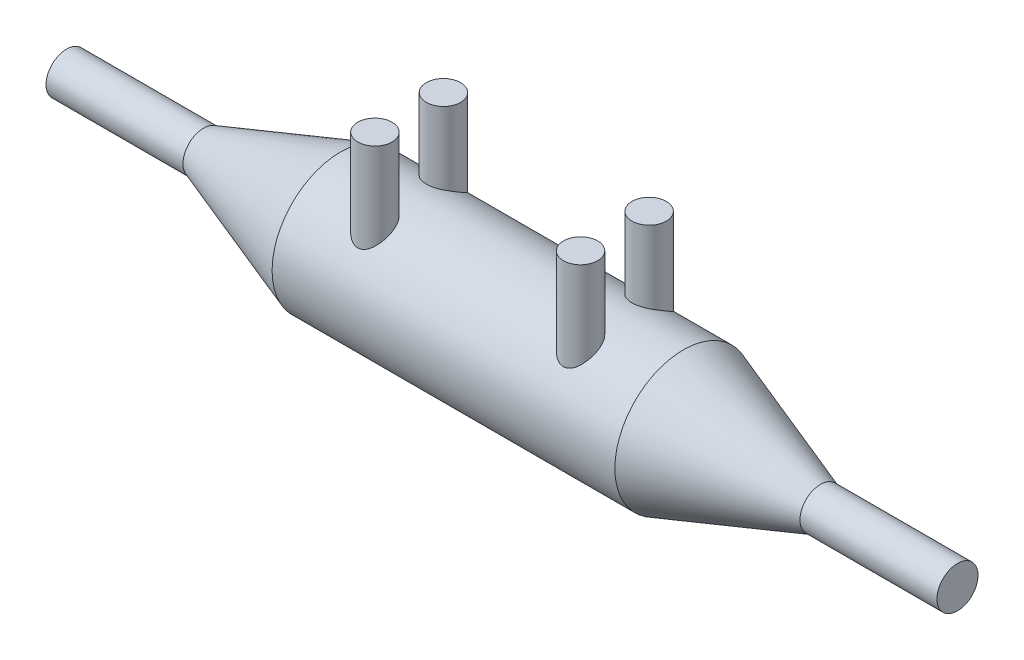
ISO-10303-21;
HEADER;
FILE_DESCRIPTION(('STEP AP214'),'2;1');
FILE_NAME('part.step','',(''),(''),'','','');
FILE_SCHEMA(('AUTOMOTIVE_DESIGN { 1 0 10303 214 1 1 1 1 }'));
ENDSEC;
DATA;
#1=APPLICATION_CONTEXT('core data for automotive mechanical design processes');
#2=APPLICATION_PROTOCOL_DEFINITION('international standard','automotive_design',2000,#1);
#3=PRODUCT_CONTEXT('',#1,'mechanical');
#4=PRODUCT('Part','Part','',(#3));
#5=PRODUCT_RELATED_PRODUCT_CATEGORY('part','',(#4));
#6=PRODUCT_DEFINITION_FORMATION('','',#4);
#7=PRODUCT_DEFINITION_CONTEXT('part definition',#1,'design');
#8=PRODUCT_DEFINITION('design','',#6,#7);
#9=PRODUCT_DEFINITION_SHAPE('','',#8);
#10=(LENGTH_UNIT() NAMED_UNIT(*) SI_UNIT(.MILLI.,.METRE.));
#11=(NAMED_UNIT(*) PLANE_ANGLE_UNIT() SI_UNIT($,.RADIAN.));
#12=(NAMED_UNIT(*) SI_UNIT($,.STERADIAN.) SOLID_ANGLE_UNIT());
#13=UNCERTAINTY_MEASURE_WITH_UNIT(LENGTH_MEASURE(1.E-05),#10,'distance_accuracy_value','');
#14=(GEOMETRIC_REPRESENTATION_CONTEXT(3) GLOBAL_UNCERTAINTY_ASSIGNED_CONTEXT((#13)) GLOBAL_UNIT_ASSIGNED_CONTEXT((#10,
#11,#12)) REPRESENTATION_CONTEXT('',''));
#15=CARTESIAN_POINT('',(0.,0.,0.));
#16=DIRECTION('',(0.,0.,1.));
#17=DIRECTION('',(1.,0.,0.));
#18=AXIS2_PLACEMENT_3D('',#15,#16,#17);
#19=CARTESIAN_POINT('',(23.6109991129555,20.,-5.));
#20=DIRECTION('',(0.,-1.,0.));
#21=DIRECTION('',(0.,0.,-1.));
#22=AXIS2_PLACEMENT_3D('',#19,#20,#21);
#23=CYLINDRICAL_SURFACE('',#22,2.5);
#24=CARTESIAN_POINT('',(23.6109991129555,20.,-5.));
#25=DIRECTION('',(0.,1.,0.));
#26=DIRECTION('',(0.,0.,-1.));
#27=AXIS2_PLACEMENT_3D('',#24,#25,#26);
#28=CIRCLE('',#27,2.5);
#29=CARTESIAN_POINT('',(23.6109991129555,20.,-7.49999999999999));
#30=VERTEX_POINT('',#29);
#31=EDGE_CURVE('E11',#30,#30,#28,.T.);
#32=ORIENTED_EDGE('',*,*,#31,.F.);
#33=EDGE_LOOP('',(#32));
#34=FACE_BOUND('',#33,.T.);
#35=CARTESIAN_POINT('',(23.6109991129555,0.,-5.));
#36=DIRECTION('',(0.,1.,0.));
#37=DIRECTION('',(0.,0.,-1.));
#38=AXIS2_PLACEMENT_3D('',#35,#36,#37);
#39=CIRCLE('',#38,2.5);
#40=CARTESIAN_POINT('',(23.6109991129555,0.,-7.49999999999999));
#41=VERTEX_POINT('',#40);
#42=EDGE_CURVE('E43',#41,#41,#39,.T.);
#43=ORIENTED_EDGE('',*,*,#42,.T.);
#44=EDGE_LOOP('',(#43));
#45=FACE_BOUND('',#44,.T.);
#46=ADVANCED_FACE('F40',(#34,#45),#23,.T.);
#47=CARTESIAN_POINT('',(23.6109991129555,20.,-5.));
#48=DIRECTION('',(0.,-1.,0.));
#49=DIRECTION('',(0.,0.,-1.));
#50=AXIS2_PLACEMENT_3D('',#47,#48,#49);
#51=PLANE('',#50);
#52=ORIENTED_EDGE('',*,*,#31,.T.);
#53=EDGE_LOOP('',(#52));
#54=FACE_BOUND('',#53,.T.);
#55=ADVANCED_FACE('F55',(#54),#51,.F.);
#56=CARTESIAN_POINT('',(23.6109991129555,0.,-5.));
#57=DIRECTION('',(0.,-1.,0.));
#58=DIRECTION('',(0.,0.,-1.));
#59=AXIS2_PLACEMENT_3D('',#56,#57,#58);
#60=PLANE('',#59);
#61=ORIENTED_EDGE('',*,*,#42,.F.);
#62=EDGE_LOOP('',(#61));
#63=FACE_BOUND('',#62,.T.);
#64=ADVANCED_FACE('F53',(#63),#60,.T.);
#65=CLOSED_SHELL('',(#46,#55,#64));
#66=MANIFOLD_SOLID_BREP('B2',#65);
#67=CARTESIAN_POINT('',(53.6109991129555,20.,-5.00000000000001));
#68=DIRECTION('',(0.,-1.,0.));
#69=DIRECTION('',(0.,0.,-1.));
#70=AXIS2_PLACEMENT_3D('',#67,#68,#69);
#71=CYLINDRICAL_SURFACE('',#70,2.5);
#72=CARTESIAN_POINT('',(53.6109991129555,20.,-5.00000000000001));
#73=DIRECTION('',(0.,1.,0.));
#74=DIRECTION('',(0.,0.,-1.));
#75=AXIS2_PLACEMENT_3D('',#72,#73,#74);
#76=CIRCLE('',#75,2.5);
#77=CARTESIAN_POINT('',(53.6109991129555,20.,-7.50000000000001));
#78=VERTEX_POINT('',#77);
#79=EDGE_CURVE('E39',#78,#78,#76,.T.);
#80=ORIENTED_EDGE('',*,*,#79,.F.);
#81=EDGE_LOOP('',(#80));
#82=FACE_BOUND('',#81,.T.);
#83=CARTESIAN_POINT('',(53.6109991129555,0.,-5.00000000000001));
#84=DIRECTION('',(0.,1.,0.));
#85=DIRECTION('',(0.,0.,-1.));
#86=AXIS2_PLACEMENT_3D('',#83,#84,#85);
#87=CIRCLE('',#86,2.5);
#88=CARTESIAN_POINT('',(53.6109991129555,0.,-7.50000000000001));
#89=VERTEX_POINT('',#88);
#90=EDGE_CURVE('E92',#89,#89,#87,.T.);
#91=ORIENTED_EDGE('',*,*,#90,.T.);
#92=EDGE_LOOP('',(#91));
#93=FACE_BOUND('',#92,.T.);
#94=ADVANCED_FACE('F89',(#82,#93),#71,.T.);
#95=CARTESIAN_POINT('',(53.6109991129555,20.,-5.00000000000001));
#96=DIRECTION('',(0.,-1.,0.));
#97=DIRECTION('',(0.,0.,-1.));
#98=AXIS2_PLACEMENT_3D('',#95,#96,#97);
#99=PLANE('',#98);
#100=ORIENTED_EDGE('',*,*,#79,.T.);
#101=EDGE_LOOP('',(#100));
#102=FACE_BOUND('',#101,.T.);
#103=ADVANCED_FACE('F104',(#102),#99,.F.);
#104=CARTESIAN_POINT('',(53.6109991129555,0.,-5.00000000000001));
#105=DIRECTION('',(0.,-1.,0.));
#106=DIRECTION('',(0.,0.,-1.));
#107=AXIS2_PLACEMENT_3D('',#104,#105,#106);
#108=PLANE('',#107);
#109=ORIENTED_EDGE('',*,*,#90,.F.);
#110=EDGE_LOOP('',(#109));
#111=FACE_BOUND('',#110,.T.);
#112=ADVANCED_FACE('F102',(#111),#108,.T.);
#113=CLOSED_SHELL('',(#94,#103,#112));
#114=MANIFOLD_SOLID_BREP('B6',#113);
#115=CARTESIAN_POINT('',(53.6109991129555,20.,5.00000000000001));
#116=DIRECTION('',(0.,-1.,0.));
#117=DIRECTION('',(0.,0.,-1.));
#118=AXIS2_PLACEMENT_3D('',#115,#116,#117);
#119=CYLINDRICAL_SURFACE('',#118,2.5);
#120=CARTESIAN_POINT('',(53.6109991129555,20.,5.00000000000001));
#121=DIRECTION('',(0.,1.,0.));
#122=DIRECTION('',(0.,0.,1.));
#123=AXIS2_PLACEMENT_3D('',#120,#121,#122);
#124=CIRCLE('',#123,2.5);
#125=CARTESIAN_POINT('',(53.6109991129555,20.,7.50000000000001));
#126=VERTEX_POINT('',#125);
#127=EDGE_CURVE('E88',#126,#126,#124,.T.);
#128=ORIENTED_EDGE('',*,*,#127,.F.);
#129=EDGE_LOOP('',(#128));
#130=FACE_BOUND('',#129,.T.);
#131=CARTESIAN_POINT('',(53.6109991129555,0.,5.00000000000001));
#132=DIRECTION('',(0.,1.,0.));
#133=DIRECTION('',(0.,0.,1.));
#134=AXIS2_PLACEMENT_3D('',#131,#132,#133);
#135=CIRCLE('',#134,2.5);
#136=CARTESIAN_POINT('',(53.6109991129555,0.,7.50000000000001));
#137=VERTEX_POINT('',#136);
#138=EDGE_CURVE('E141',#137,#137,#135,.T.);
#139=ORIENTED_EDGE('',*,*,#138,.T.);
#140=EDGE_LOOP('',(#139));
#141=FACE_BOUND('',#140,.T.);
#142=ADVANCED_FACE('F138',(#130,#141),#119,.T.);
#143=CARTESIAN_POINT('',(53.6109991129555,20.,5.00000000000001));
#144=DIRECTION('',(0.,1.,0.));
#145=DIRECTION('',(0.,0.,1.));
#146=AXIS2_PLACEMENT_3D('',#143,#144,#145);
#147=PLANE('',#146);
#148=ORIENTED_EDGE('',*,*,#127,.T.);
#149=EDGE_LOOP('',(#148));
#150=FACE_BOUND('',#149,.T.);
#151=ADVANCED_FACE('F153',(#150),#147,.T.);
#152=CARTESIAN_POINT('',(53.6109991129555,0.,5.00000000000001));
#153=DIRECTION('',(0.,1.,0.));
#154=DIRECTION('',(0.,0.,1.));
#155=AXIS2_PLACEMENT_3D('',#152,#153,#154);
#156=PLANE('',#155);
#157=ORIENTED_EDGE('',*,*,#138,.F.);
#158=EDGE_LOOP('',(#157));
#159=FACE_BOUND('',#158,.T.);
#160=ADVANCED_FACE('F151',(#159),#156,.F.);
#161=CLOSED_SHELL('',(#142,#151,#160));
#162=MANIFOLD_SOLID_BREP('B34',#161);
#163=CARTESIAN_POINT('',(23.6109991129555,20.,5.));
#164=DIRECTION('',(0.,-1.,0.));
#165=DIRECTION('',(0.,0.,-1.));
#166=AXIS2_PLACEMENT_3D('',#163,#164,#165);
#167=CYLINDRICAL_SURFACE('',#166,2.5);
#168=CARTESIAN_POINT('',(23.6109991129555,20.,5.));
#169=DIRECTION('',(0.,1.,0.));
#170=DIRECTION('',(0.,0.,1.));
#171=AXIS2_PLACEMENT_3D('',#168,#169,#170);
#172=CIRCLE('',#171,2.5);
#173=CARTESIAN_POINT('',(23.6109991129555,20.,7.5));
#174=VERTEX_POINT('',#173);
#175=EDGE_CURVE('E137',#174,#174,#172,.T.);
#176=ORIENTED_EDGE('',*,*,#175,.F.);
#177=EDGE_LOOP('',(#176));
#178=FACE_BOUND('',#177,.T.);
#179=CARTESIAN_POINT('',(23.6109991129555,0.,5.));
#180=DIRECTION('',(0.,1.,0.));
#181=DIRECTION('',(0.,0.,1.));
#182=AXIS2_PLACEMENT_3D('',#179,#180,#181);
#183=CIRCLE('',#182,2.5);
#184=CARTESIAN_POINT('',(23.6109991129555,0.,7.5));
#185=VERTEX_POINT('',#184);
#186=EDGE_CURVE('E189',#185,#185,#183,.T.);
#187=ORIENTED_EDGE('',*,*,#186,.T.);
#188=EDGE_LOOP('',(#187));
#189=FACE_BOUND('',#188,.T.);
#190=ADVANCED_FACE('F186',(#178,#189),#167,.T.);
#191=CARTESIAN_POINT('',(23.6109991129555,20.,5.));
#192=DIRECTION('',(0.,1.,0.));
#193=DIRECTION('',(0.,0.,1.));
#194=AXIS2_PLACEMENT_3D('',#191,#192,#193);
#195=PLANE('',#194);
#196=ORIENTED_EDGE('',*,*,#175,.T.);
#197=EDGE_LOOP('',(#196));
#198=FACE_BOUND('',#197,.T.);
#199=ADVANCED_FACE('F201',(#198),#195,.T.);
#200=CARTESIAN_POINT('',(23.6109991129555,0.,5.));
#201=DIRECTION('',(0.,1.,0.));
#202=DIRECTION('',(0.,0.,1.));
#203=AXIS2_PLACEMENT_3D('',#200,#201,#202);
#204=PLANE('',#203);
#205=ORIENTED_EDGE('',*,*,#186,.F.);
#206=EDGE_LOOP('',(#205));
#207=FACE_BOUND('',#206,.T.);
#208=ADVANCED_FACE('F199',(#207),#204,.F.);
#209=CLOSED_SHELL('',(#190,#199,#208));
#210=MANIFOLD_SOLID_BREP('B83',#209);
#211=CARTESIAN_POINT('',(-30.0767190883829,0.,0.));
#212=DIRECTION('',(-1.,0.,0.));
#213=DIRECTION('',(0.,0.,1.));
#214=AXIS2_PLACEMENT_3D('',#211,#212,#213);
#215=CYLINDRICAL_SURFACE('',#214,3.);
#216=CARTESIAN_POINT('',(-6.38900088704453,0.,0.));
#217=DIRECTION('',(-1.,0.,0.));
#218=DIRECTION('',(0.,0.,1.));
#219=AXIS2_PLACEMENT_3D('',#216,#217,#218);
#220=CIRCLE('',#219,3.);
#221=CARTESIAN_POINT('',(-6.38900088704453,0.,-3.));
#222=VERTEX_POINT('',#221);
#223=EDGE_CURVE('E249',#222,#222,#220,.T.);
#224=ORIENTED_EDGE('',*,*,#223,.T.);
#225=EDGE_LOOP('',(#224));
#226=FACE_BOUND('',#225,.T.);
#227=CARTESIAN_POINT('',(-26.3682484582412,0.,0.));
#228=DIRECTION('',(-1.,0.,0.));
#229=DIRECTION('',(0.,0.,1.));
#230=AXIS2_PLACEMENT_3D('',#227,#228,#229);
#231=CIRCLE('',#230,3.);
#232=CARTESIAN_POINT('',(-26.3682484582412,0.,3.));
#233=VERTEX_POINT('',#232);
#234=EDGE_CURVE('E185',#233,#233,#231,.T.);
#235=ORIENTED_EDGE('',*,*,#234,.F.);
#236=EDGE_LOOP('',(#235));
#237=FACE_BOUND('',#236,.T.);
#238=ADVANCED_FACE('F227',(#226,#237),#215,.T.);
#239=CARTESIAN_POINT('',(-26.3682484582412,-3.,0.));
#240=DIRECTION('',(-1.,0.,0.));
#241=DIRECTION('',(0.,0.,1.));
#242=AXIS2_PLACEMENT_3D('',#239,#240,#241);
#243=PLANE('',#242);
#244=ORIENTED_EDGE('',*,*,#234,.T.);
#245=EDGE_LOOP('',(#244));
#246=FACE_BOUND('',#245,.T.);
#247=ADVANCED_FACE('F267',(#246),#243,.T.);
#248=CARTESIAN_POINT('',(103.590246684152,-2.99999999999999,0.));
#249=DIRECTION('',(1.,0.,0.));
#250=DIRECTION('',(0.,0.,-1.));
#251=AXIS2_PLACEMENT_3D('',#248,#249,#250);
#252=PLANE('',#251);
#253=CARTESIAN_POINT('',(103.590246684152,0.,0.));
#254=DIRECTION('',(-1.,0.,0.));
#255=DIRECTION('',(0.,0.,1.));
#256=AXIS2_PLACEMENT_3D('',#253,#254,#255);
#257=CIRCLE('',#256,2.99999999999999);
#258=CARTESIAN_POINT('',(103.590246684152,0.,2.99999999999999));
#259=VERTEX_POINT('',#258);
#260=EDGE_CURVE('E233',#259,#259,#257,.T.);
#261=ORIENTED_EDGE('',*,*,#260,.F.);
#262=EDGE_LOOP('',(#261));
#263=FACE_BOUND('',#262,.T.);
#264=ADVANCED_FACE('F271',(#263),#252,.T.);
#265=CARTESIAN_POINT('',(-30.0767190883829,0.,0.));
#266=DIRECTION('',(-1.,0.,0.));
#267=DIRECTION('',(0.,0.,1.));
#268=AXIS2_PLACEMENT_3D('',#265,#266,#267);
#269=CYLINDRICAL_SURFACE('',#268,2.99999999999999);
#270=ORIENTED_EDGE('',*,*,#260,.T.);
#271=EDGE_LOOP('',(#270));
#272=FACE_BOUND('',#271,.T.);
#273=CARTESIAN_POINT('',(83.6109991129555,0.,0.));
#274=DIRECTION('',(-1.,0.,0.));
#275=DIRECTION('',(0.,0.,1.));
#276=AXIS2_PLACEMENT_3D('',#273,#274,#275);
#277=CIRCLE('',#276,2.99999999999999);
#278=CARTESIAN_POINT('',(83.6109991129555,0.,2.99999999999999));
#279=VERTEX_POINT('',#278);
#280=EDGE_CURVE('E237',#279,#279,#277,.T.);
#281=ORIENTED_EDGE('',*,*,#280,.F.);
#282=EDGE_LOOP('',(#281));
#283=FACE_BOUND('',#282,.T.);
#284=ADVANCED_FACE('F275',(#272,#283),#269,.T.);
#285=CARTESIAN_POINT('',(63.6109991129555,0.,0.));
#286=DIRECTION('',(-1.,0.,0.));
#287=DIRECTION('',(0.,0.,1.));
#288=AXIS2_PLACEMENT_3D('',#285,#286,#287);
#289=CONICAL_SURFACE('',#288,9.99999999999999,0.336674819386727);
#290=CARTESIAN_POINT('',(63.6109991129555,0.,0.));
#291=DIRECTION('',(-1.,0.,0.));
#292=DIRECTION('',(0.,0.,1.));
#293=AXIS2_PLACEMENT_3D('',#290,#291,#292);
#294=CIRCLE('',#293,9.99999999999999);
#295=CARTESIAN_POINT('',(63.6109991129555,0.,9.99999999999999));
#296=VERTEX_POINT('',#295);
#297=EDGE_CURVE('E241',#296,#296,#294,.T.);
#298=CARTESIAN_POINT('',(83.6109991129555,0.,2.99999999999999));
#299=CARTESIAN_POINT('',(83.4026657796222,0.,3.07291666666665));
#300=CARTESIAN_POINT('',(83.1943324462888,0.,3.14583333333332));
#301=CARTESIAN_POINT('',(82.7776657796222,0.,3.29166666666666));
#302=CARTESIAN_POINT('',(82.5693324462888,0.,3.36458333333333));
#303=CARTESIAN_POINT('',(82.1526657796222,0.,3.51041666666666));
#304=CARTESIAN_POINT('',(81.9443324462888,0.,3.58333333333332));
#305=CARTESIAN_POINT('',(81.5276657796222,0.,3.72916666666666));
#306=CARTESIAN_POINT('',(81.3193324462888,0.,3.80208333333333));
#307=CARTESIAN_POINT('',(80.9026657796222,0.,3.94791666666666));
#308=CARTESIAN_POINT('',(80.6943324462888,0.,4.02083333333332));
#309=CARTESIAN_POINT('',(80.2776657796222,0.,4.16666666666666));
#310=CARTESIAN_POINT('',(80.0693324462888,0.,4.23958333333332));
#311=CARTESIAN_POINT('',(79.6526657796222,0.,4.38541666666666));
#312=CARTESIAN_POINT('',(79.4443324462888,0.,4.45833333333332));
#313=CARTESIAN_POINT('',(79.0276657796222,0.,4.60416666666666));
#314=CARTESIAN_POINT('',(78.8193324462888,0.,4.67708333333333));
#315=CARTESIAN_POINT('',(78.4026657796222,0.,4.82291666666666));
#316=CARTESIAN_POINT('',(78.1943324462888,0.,4.89583333333333));
#317=CARTESIAN_POINT('',(77.7776657796222,0.,5.04166666666666));
#318=CARTESIAN_POINT('',(77.5693324462888,0.,5.11458333333333));
#319=CARTESIAN_POINT('',(77.1526657796222,0.,5.26041666666666));
#320=CARTESIAN_POINT('',(76.9443324462888,0.,5.33333333333332));
#321=CARTESIAN_POINT('',(76.5276657796222,0.,5.47916666666666));
#322=CARTESIAN_POINT('',(76.3193324462888,0.,5.55208333333333));
#323=CARTESIAN_POINT('',(75.9026657796222,0.,5.69791666666666));
#324=CARTESIAN_POINT('',(75.6943324462888,0.,5.77083333333333));
#325=CARTESIAN_POINT('',(75.2776657796222,0.,5.91666666666666));
#326=CARTESIAN_POINT('',(75.0693324462888,0.,5.98958333333332));
#327=CARTESIAN_POINT('',(74.6526657796222,0.,6.13541666666666));
#328=CARTESIAN_POINT('',(74.4443324462888,0.,6.20833333333332));
#329=CARTESIAN_POINT('',(74.0276657796222,0.,6.35416666666666));
#330=CARTESIAN_POINT('',(73.8193324462888,0.,6.42708333333332));
#331=CARTESIAN_POINT('',(73.4026657796222,0.,6.57291666666666));
#332=CARTESIAN_POINT('',(73.1943324462888,0.,6.64583333333333));
#333=CARTESIAN_POINT('',(72.7776657796222,0.,6.79166666666666));
#334=CARTESIAN_POINT('',(72.5693324462888,0.,6.86458333333333));
#335=CARTESIAN_POINT('',(72.1526657796222,0.,7.01041666666666));
#336=CARTESIAN_POINT('',(71.9443324462888,0.,7.08333333333332));
#337=CARTESIAN_POINT('',(71.5276657796222,0.,7.22916666666666));
#338=CARTESIAN_POINT('',(71.3193324462888,0.,7.30208333333332));
#339=CARTESIAN_POINT('',(70.9026657796222,0.,7.44791666666666));
#340=CARTESIAN_POINT('',(70.6943324462888,0.,7.52083333333333));
#341=CARTESIAN_POINT('',(70.2776657796222,0.,7.66666666666666));
#342=CARTESIAN_POINT('',(70.0693324462888,0.,7.73958333333332));
#343=CARTESIAN_POINT('',(69.6526657796221,0.,7.88541666666666));
#344=CARTESIAN_POINT('',(69.4443324462888,0.,7.95833333333332));
#345=CARTESIAN_POINT('',(69.0276657796221,0.,8.10416666666666));
#346=CARTESIAN_POINT('',(68.8193324462888,0.,8.17708333333332));
#347=CARTESIAN_POINT('',(68.4026657796221,0.,8.32291666666666));
#348=CARTESIAN_POINT('',(68.1943324462888,0.,8.39583333333332));
#349=CARTESIAN_POINT('',(67.7776657796221,0.,8.54166666666666));
#350=CARTESIAN_POINT('',(67.5693324462888,0.,8.61458333333332));
#351=CARTESIAN_POINT('',(67.1526657796221,0.,8.76041666666666));
#352=CARTESIAN_POINT('',(66.9443324462888,0.,8.83333333333333));
#353=CARTESIAN_POINT('',(66.5276657796221,0.,8.97916666666666));
#354=CARTESIAN_POINT('',(66.3193324462888,0.,9.05208333333332));
#355=CARTESIAN_POINT('',(65.9026657796222,0.,9.19791666666666));
#356=CARTESIAN_POINT('',(65.6943324462888,0.,9.27083333333333));
#357=CARTESIAN_POINT('',(65.2776657796222,0.,9.41666666666666));
#358=CARTESIAN_POINT('',(65.0693324462888,0.,9.48958333333332));
#359=CARTESIAN_POINT('',(64.6526657796222,0.,9.63541666666666));
#360=CARTESIAN_POINT('',(64.4443324462888,0.,9.70833333333332));
#361=CARTESIAN_POINT('',(64.0276657796222,0.,9.85416666666666));
#362=CARTESIAN_POINT('',(63.8193324462888,0.,9.92708333333333));
#363=CARTESIAN_POINT('',(63.6109991129555,0.,9.99999999999999));
#364=B_SPLINE_CURVE_WITH_KNOTS('',3,(#298,#299,#300,#301,#302,#303,#304,#305,#306,#307,#308,
#309,#310,#311,#312,#313,#314,#315,#316,#317,#318,#319,#320,#321,#322,#323,#324,#325,#326,#327,
#328,#329,#330,#331,#332,#333,#334,#335,#336,#337,#338,#339,#340,#341,#342,#343,#344,#345,#346,
#347,#348,#349,#350,#351,#352,#353,#354,#355,#356,#357,#358,#359,#360,#361,#362,#363),
.UNSPECIFIED.,.F.,.F.,(4,2,2,2,2,2,2,2,2,2,2,2,2,2,2,2,2,2,2,2,2,2,2,2,2,2,2,2,2,2,2,2,4),(0.,
0.662175628138048,1.32435125627607,1.98652688441412,2.64870251255214,3.31087814069017,
3.97305376882821,4.63522939696624,5.29740502510428,5.95958065324231,6.62175628138035,
7.28393190951838,7.94610753765642,8.60828316579445,9.27045879393249,9.93263442207052,
10.5948100502086,11.2569856783466,11.9191613064846,12.5813369346227,13.2435125627607,
13.9056881908987,14.5678638190368,15.2300394471748,15.8922150753128,16.5543907034509,
17.2165663315889,17.8787419597269,18.540917587865,19.203093216003,19.865268844141,
20.5274444722791,21.1896201004171),.UNSPECIFIED.);
#365=EDGE_CURVE('BSEAM263',#279,#296,#364,.T.);
#366=ORIENTED_EDGE('',*,*,#280,.T.);
#367=ORIENTED_EDGE('',*,*,#297,.F.);
#368=ORIENTED_EDGE('',*,*,#365,.T.);
#369=ORIENTED_EDGE('',*,*,#365,.F.);
#370=EDGE_LOOP('',(#366,#368,#367,#369));
#371=FACE_BOUND('',#370,.T.);
#372=ADVANCED_FACE('F263',(#371),#289,.T.);
#373=CARTESIAN_POINT('',(-30.0767190883829,0.,0.));
#374=DIRECTION('',(-1.,0.,0.));
#375=DIRECTION('',(0.,0.,1.));
#376=AXIS2_PLACEMENT_3D('',#373,#374,#375);
#377=CYLINDRICAL_SURFACE('',#376,9.99999999999999);
#378=ORIENTED_EDGE('',*,*,#297,.T.);
#379=EDGE_LOOP('',(#378));
#380=FACE_BOUND('',#379,.T.);
#381=CARTESIAN_POINT('',(13.6109991129555,0.,0.));
#382=DIRECTION('',(-1.,0.,0.));
#383=DIRECTION('',(0.,0.,1.));
#384=AXIS2_PLACEMENT_3D('',#381,#382,#383);
#385=CIRCLE('',#384,10.);
#386=CARTESIAN_POINT('',(13.6109991129555,0.,-10.));
#387=VERTEX_POINT('',#386);
#388=EDGE_CURVE('E246',#387,#387,#385,.T.);
#389=ORIENTED_EDGE('',*,*,#388,.F.);
#390=EDGE_LOOP('',(#389));
#391=FACE_BOUND('',#390,.T.);
#392=ADVANCED_FACE('F257',(#380,#391),#377,.T.);
#393=CARTESIAN_POINT('',(-6.38900088704453,0.,0.));
#394=DIRECTION('',(1.,0.,0.));
#395=DIRECTION('',(0.,0.,-1.));
#396=AXIS2_PLACEMENT_3D('',#393,#394,#395);
#397=CONICAL_SURFACE('',#396,3.,0.336674819386727);
#398=CARTESIAN_POINT('',(13.6109991129555,0.,-10.));
#399=CARTESIAN_POINT('',(13.4026657796221,0.,-9.92708333333333));
#400=CARTESIAN_POINT('',(13.1943324462888,0.,-9.85416666666666));
#401=CARTESIAN_POINT('',(12.7776657796221,0.,-9.70833333333333));
#402=CARTESIAN_POINT('',(12.5693324462888,0.,-9.63541666666666));
#403=CARTESIAN_POINT('',(12.1526657796221,0.,-9.48958333333333));
#404=CARTESIAN_POINT('',(11.9443324462888,0.,-9.41666666666666));
#405=CARTESIAN_POINT('',(11.5276657796221,0.,-9.27083333333333));
#406=CARTESIAN_POINT('',(11.3193324462888,0.,-9.19791666666666));
#407=CARTESIAN_POINT('',(10.9026657796221,0.,-9.05208333333333));
#408=CARTESIAN_POINT('',(10.6943324462888,0.,-8.97916666666666));
#409=CARTESIAN_POINT('',(10.2776657796221,0.,-8.83333333333333));
#410=CARTESIAN_POINT('',(10.0693324462888,0.,-8.76041666666666));
#411=CARTESIAN_POINT('',(9.65266577962213,0.,-8.61458333333333));
#412=CARTESIAN_POINT('',(9.4443324462888,0.,-8.54166666666666));
#413=CARTESIAN_POINT('',(9.02766577962213,0.,-8.39583333333333));
#414=CARTESIAN_POINT('',(8.8193324462888,0.,-8.32291666666666));
#415=CARTESIAN_POINT('',(8.40266577962213,0.,-8.17708333333333));
#416=CARTESIAN_POINT('',(8.1943324462888,0.,-8.10416666666666));
#417=CARTESIAN_POINT('',(7.77766577962213,0.,-7.95833333333333));
#418=CARTESIAN_POINT('',(7.5693324462888,0.,-7.88541666666666));
#419=CARTESIAN_POINT('',(7.15266577962213,0.,-7.73958333333333));
#420=CARTESIAN_POINT('',(6.9443324462888,0.,-7.66666666666666));
#421=CARTESIAN_POINT('',(6.52766577962213,0.,-7.52083333333333));
#422=CARTESIAN_POINT('',(6.3193324462888,0.,-7.44791666666666));
#423=CARTESIAN_POINT('',(5.90266577962213,0.,-7.30208333333333));
#424=CARTESIAN_POINT('',(5.6943324462888,0.,-7.22916666666666));
#425=CARTESIAN_POINT('',(5.27766577962213,0.,-7.08333333333333));
#426=CARTESIAN_POINT('',(5.0693324462888,0.,-7.01041666666666));
#427=CARTESIAN_POINT('',(4.65266577962213,0.,-6.86458333333333));
#428=CARTESIAN_POINT('',(4.4443324462888,0.,-6.79166666666666));
#429=CARTESIAN_POINT('',(4.02766577962213,0.,-6.64583333333333));
#430=CARTESIAN_POINT('',(3.8193324462888,0.,-6.57291666666666));
#431=CARTESIAN_POINT('',(3.40266577962213,0.,-6.42708333333333));
#432=CARTESIAN_POINT('',(3.1943324462888,0.,-6.35416666666666));
#433=CARTESIAN_POINT('',(2.77766577962213,0.,-6.20833333333333));
#434=CARTESIAN_POINT('',(2.5693324462888,0.,-6.13541666666667));
#435=CARTESIAN_POINT('',(2.15266577962213,0.,-5.98958333333333));
#436=CARTESIAN_POINT('',(1.9443324462888,0.,-5.91666666666667));
#437=CARTESIAN_POINT('',(1.52766577962213,0.,-5.77083333333333));
#438=CARTESIAN_POINT('',(1.3193324462888,0.,-5.69791666666666));
#439=CARTESIAN_POINT('',(0.902665779622132,0.,-5.55208333333333));
#440=CARTESIAN_POINT('',(0.694332446288799,0.,-5.47916666666666));
#441=CARTESIAN_POINT('',(0.277665779622132,0.,-5.33333333333333));
#442=CARTESIAN_POINT('',(0.0693324462887983,0.,-5.26041666666666));
#443=CARTESIAN_POINT('',(-0.347334220377868,0.,-5.11458333333333));
#444=CARTESIAN_POINT('',(-0.555667553711201,0.,-5.04166666666667));
#445=CARTESIAN_POINT('',(-0.972334220377868,0.,-4.89583333333333));
#446=CARTESIAN_POINT('',(-1.1806675537112,0.,-4.82291666666667));
#447=CARTESIAN_POINT('',(-1.59733422037787,0.,-4.67708333333333));
#448=CARTESIAN_POINT('',(-1.8056675537112,0.,-4.60416666666667));
#449=CARTESIAN_POINT('',(-2.22233422037787,0.,-4.45833333333333));
#450=CARTESIAN_POINT('',(-2.4306675537112,0.,-4.38541666666667));
#451=CARTESIAN_POINT('',(-2.84733422037787,0.,-4.23958333333333));
#452=CARTESIAN_POINT('',(-3.0556675537112,0.,-4.16666666666667));
#453=CARTESIAN_POINT('',(-3.47233422037787,0.,-4.02083333333333));
#454=CARTESIAN_POINT('',(-3.6806675537112,0.,-3.94791666666667));
#455=CARTESIAN_POINT('',(-4.09733422037787,0.,-3.80208333333333));
#456=CARTESIAN_POINT('',(-4.3056675537112,0.,-3.72916666666667));
#457=CARTESIAN_POINT('',(-4.72233422037787,0.,-3.58333333333333));
#458=CARTESIAN_POINT('',(-4.9306675537112,0.,-3.51041666666667));
#459=CARTESIAN_POINT('',(-5.34733422037787,0.,-3.36458333333333));
#460=CARTESIAN_POINT('',(-5.5556675537112,0.,-3.29166666666667));
#461=CARTESIAN_POINT('',(-5.97233422037787,0.,-3.14583333333333));
#462=CARTESIAN_POINT('',(-6.1806675537112,0.,-3.07291666666667));
#463=CARTESIAN_POINT('',(-6.38900088704453,0.,-3.));
#464=B_SPLINE_CURVE_WITH_KNOTS('',3,(#398,#399,#400,#401,#402,#403,#404,#405,#406,#407,#408,
#409,#410,#411,#412,#413,#414,#415,#416,#417,#418,#419,#420,#421,#422,#423,#424,#425,#426,#427,
#428,#429,#430,#431,#432,#433,#434,#435,#436,#437,#438,#439,#440,#441,#442,#443,#444,#445,#446,
#447,#448,#449,#450,#451,#452,#453,#454,#455,#456,#457,#458,#459,#460,#461,#462,#463),
.UNSPECIFIED.,.F.,.F.,(4,2,2,2,2,2,2,2,2,2,2,2,2,2,2,2,2,2,2,2,2,2,2,2,2,2,2,2,2,2,2,2,4),(0.,
0.662175628138035,1.32435125627607,1.9865268844141,2.64870251255214,3.31087814069017,
3.9730537688282,4.63522939696624,5.29740502510427,5.95958065324231,6.62175628138034,
7.28393190951838,7.94610753765641,8.60828316579444,9.27045879393248,9.93263442207051,
10.5948100502085,11.2569856783466,11.9191613064846,12.5813369346226,13.2435125627607,
13.9056881908987,14.5678638190368,15.2300394471748,15.8922150753128,16.5543907034509,
17.2165663315889,17.8787419597269,18.540917587865,19.203093216003,19.865268844141,
20.5274444722791,21.1896201004171),.UNSPECIFIED.);
#465=EDGE_CURVE('BSEAM255',#387,#222,#464,.T.);
#466=ORIENTED_EDGE('',*,*,#388,.T.);
#467=ORIENTED_EDGE('',*,*,#223,.F.);
#468=ORIENTED_EDGE('',*,*,#465,.T.);
#469=ORIENTED_EDGE('',*,*,#465,.F.);
#470=EDGE_LOOP('',(#466,#468,#467,#469));
#471=FACE_BOUND('',#470,.T.);
#472=ADVANCED_FACE('F255',(#471),#397,.T.);
#473=CLOSED_SHELL('',(#238,#247,#264,#284,#372,#392,#472));
#474=MANIFOLD_SOLID_BREP('B132',#473);
#475=ADVANCED_BREP_SHAPE_REPRESENTATION('',(#18,#66,#114,#162,#210,#474),#14);
#476=SHAPE_DEFINITION_REPRESENTATION(#9,#475);
ENDSEC;
END-ISO-10303-21;
